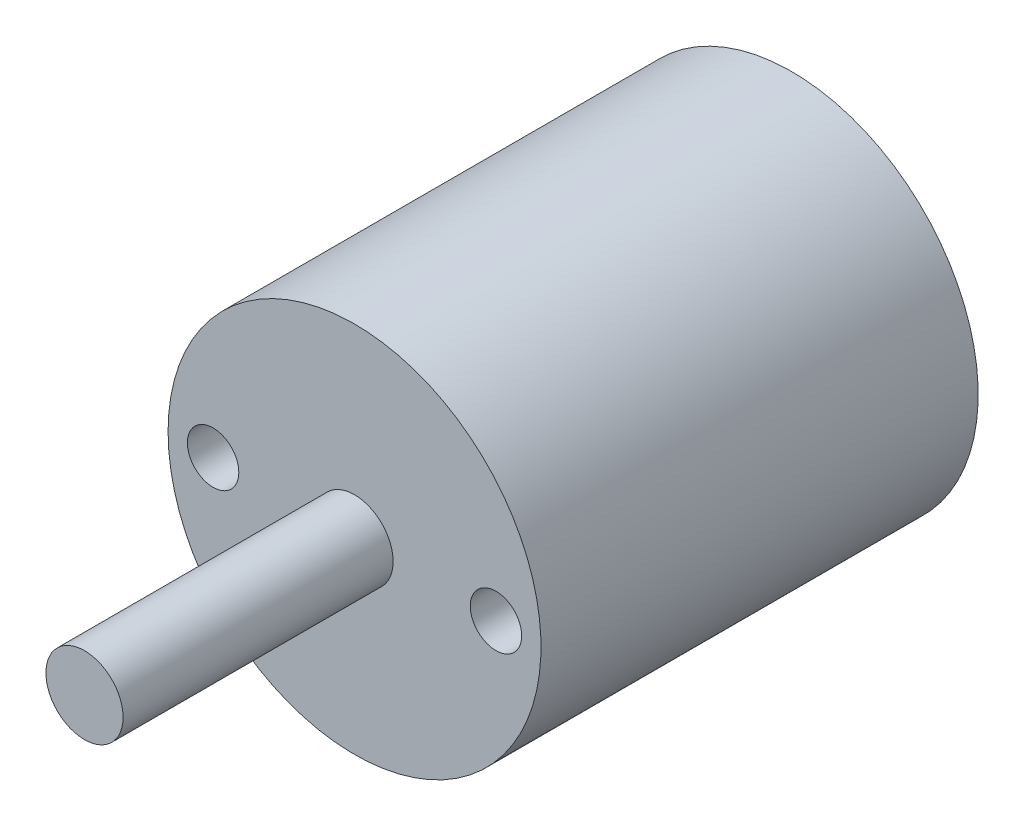
ISO-10303-21;
HEADER;
FILE_DESCRIPTION(('STEP AP214'),'2;1');
FILE_NAME('part.step','',(''),(''),'','','');
FILE_SCHEMA(('AUTOMOTIVE_DESIGN { 1 0 10303 214 1 1 1 1 }'));
ENDSEC;
DATA;
#1=APPLICATION_CONTEXT('core data for automotive mechanical design processes');
#2=APPLICATION_PROTOCOL_DEFINITION('international standard','automotive_design',2000,#1);
#3=PRODUCT_CONTEXT('',#1,'mechanical');
#4=PRODUCT('Part','Part','',(#3));
#5=PRODUCT_RELATED_PRODUCT_CATEGORY('part','',(#4));
#6=PRODUCT_DEFINITION_FORMATION('','',#4);
#7=PRODUCT_DEFINITION_CONTEXT('part definition',#1,'design');
#8=PRODUCT_DEFINITION('design','',#6,#7);
#9=PRODUCT_DEFINITION_SHAPE('','',#8);
#10=(LENGTH_UNIT() NAMED_UNIT(*) SI_UNIT(.MILLI.,.METRE.));
#11=(NAMED_UNIT(*) PLANE_ANGLE_UNIT() SI_UNIT($,.RADIAN.));
#12=(NAMED_UNIT(*) SI_UNIT($,.STERADIAN.) SOLID_ANGLE_UNIT());
#13=UNCERTAINTY_MEASURE_WITH_UNIT(LENGTH_MEASURE(1.E-05),#10,'distance_accuracy_value','');
#14=(GEOMETRIC_REPRESENTATION_CONTEXT(3) GLOBAL_UNCERTAINTY_ASSIGNED_CONTEXT((#13)) GLOBAL_UNIT_ASSIGNED_CONTEXT((#10,
#11,#12)) REPRESENTATION_CONTEXT('',''));
#15=CARTESIAN_POINT('',(0.,0.,0.));
#16=DIRECTION('',(0.,0.,1.));
#17=DIRECTION('',(1.,0.,0.));
#18=AXIS2_PLACEMENT_3D('',#15,#16,#17);
#19=CARTESIAN_POINT('',(0.,0.,0.));
#20=DIRECTION('',(0.,0.,1.));
#21=DIRECTION('',(1.,0.,0.));
#22=AXIS2_PLACEMENT_3D('',#19,#20,#21);
#23=PLANE('',#22);
#24=CARTESIAN_POINT('',(0.,0.,0.));
#25=DIRECTION('',(0.,0.,1.));
#26=DIRECTION('',(1.,0.,0.));
#27=AXIS2_PLACEMENT_3D('',#24,#25,#26);
#28=CIRCLE('',#27,7.25);
#29=CARTESIAN_POINT('',(-7.25,0.,0.));
#30=VERTEX_POINT('',#29);
#31=EDGE_CURVE('P0_E11',#30,#30,#28,.T.);
#32=ORIENTED_EDGE('',*,*,#31,.F.);
#33=EDGE_LOOP('',(#32));
#34=FACE_BOUND('',#33,.T.);
#35=ADVANCED_FACE('P0_F16',(#34),#23,.F.);
#36=CARTESIAN_POINT('',(0.,0.,17.));
#37=DIRECTION('',(0.,0.,1.));
#38=DIRECTION('',(1.,0.,0.));
#39=AXIS2_PLACEMENT_3D('',#36,#37,#38);
#40=PLANE('',#39);
#41=CARTESIAN_POINT('',(5.5,0.,17.));
#42=DIRECTION('',(0.,0.,-1.));
#43=DIRECTION('',(-1.,0.,0.));
#44=AXIS2_PLACEMENT_3D('',#41,#42,#43);
#45=CIRCLE('',#44,1.);
#46=CARTESIAN_POINT('',(6.5,0.,17.));
#47=VERTEX_POINT('',#46);
#48=EDGE_CURVE('P0_E72',#47,#47,#45,.T.);
#49=ORIENTED_EDGE('',*,*,#48,.T.);
#50=EDGE_LOOP('',(#49));
#51=FACE_BOUND('',#50,.T.);
#52=CARTESIAN_POINT('',(-5.5,0.,17.));
#53=DIRECTION('',(0.,0.,-1.));
#54=DIRECTION('',(-1.,0.,0.));
#55=AXIS2_PLACEMENT_3D('',#52,#53,#54);
#56=CIRCLE('',#55,1.);
#57=CARTESIAN_POINT('',(-4.5,0.,17.));
#58=VERTEX_POINT('',#57);
#59=EDGE_CURVE('P0_E56',#58,#58,#56,.T.);
#60=ORIENTED_EDGE('',*,*,#59,.T.);
#61=EDGE_LOOP('',(#60));
#62=FACE_BOUND('',#61,.T.);
#63=CARTESIAN_POINT('',(0.,0.,17.));
#64=DIRECTION('',(0.,0.,1.));
#65=DIRECTION('',(1.,0.,0.));
#66=AXIS2_PLACEMENT_3D('',#63,#64,#65);
#67=CIRCLE('',#66,7.25);
#68=CARTESIAN_POINT('',(-7.25,0.,17.));
#69=VERTEX_POINT('',#68);
#70=EDGE_CURVE('P0_E78',#69,#69,#67,.T.);
#71=ORIENTED_EDGE('',*,*,#70,.T.);
#72=EDGE_LOOP('',(#71));
#73=FACE_BOUND('',#72,.T.);
#74=ADVANCED_FACE('P0_F62',(#51,#62,#73),#40,.T.);
#75=CARTESIAN_POINT('',(0.,0.,0.));
#76=DIRECTION('',(0.,0.,1.));
#77=DIRECTION('',(1.,0.,0.));
#78=AXIS2_PLACEMENT_3D('',#75,#76,#77);
#79=CYLINDRICAL_SURFACE('',#78,7.25);
#80=ORIENTED_EDGE('',*,*,#70,.F.);
#81=DIRECTION('',(0.,0.,-1.));
#82=VECTOR('',#81,1.);
#83=CARTESIAN_POINT('',(-7.25,0.,0.));
#84=LINE('',#83,#82);
#85=EDGE_CURVE('P0_E27',#69,#30,#84,.T.);
#86=ORIENTED_EDGE('',*,*,#85,.T.);
#87=ORIENTED_EDGE('',*,*,#31,.T.);
#88=ORIENTED_EDGE('',*,*,#85,.F.);
#89=EDGE_LOOP('',(#80,#86,#87,#88));
#90=FACE_BOUND('',#89,.T.);
#91=ADVANCED_FACE('P0_F121',(#90),#79,.T.);
#92=CARTESIAN_POINT('',(5.5,0.,12.));
#93=DIRECTION('',(0.,0.,1.));
#94=DIRECTION('',(1.,0.,0.));
#95=AXIS2_PLACEMENT_3D('',#92,#93,#94);
#96=PLANE('',#95);
#97=CARTESIAN_POINT('',(5.5,0.,12.));
#98=DIRECTION('',(0.,0.,-1.));
#99=DIRECTION('',(-1.,0.,0.));
#100=AXIS2_PLACEMENT_3D('',#97,#98,#99);
#101=CIRCLE('',#100,1.);
#102=CARTESIAN_POINT('',(6.5,0.,12.));
#103=VERTEX_POINT('',#102);
#104=EDGE_CURVE('P0_E70',#103,#103,#101,.T.);
#105=ORIENTED_EDGE('',*,*,#104,.F.);
#106=EDGE_LOOP('',(#105));
#107=FACE_BOUND('',#106,.T.);
#108=ADVANCED_FACE('P0_F18',(#107),#96,.T.);
#109=CARTESIAN_POINT('',(5.5,0.,17.));
#110=DIRECTION('',(0.,0.,-1.));
#111=DIRECTION('',(-1.,0.,0.));
#112=AXIS2_PLACEMENT_3D('',#109,#110,#111);
#113=CYLINDRICAL_SURFACE('',#112,1.);
#114=ORIENTED_EDGE('',*,*,#48,.F.);
#115=DIRECTION('',(0.,0.,-1.));
#116=VECTOR('',#115,1.);
#117=CARTESIAN_POINT('',(6.5,0.,17.));
#118=LINE('',#117,#116);
#119=EDGE_CURVE('P0_E20',#47,#103,#118,.T.);
#120=ORIENTED_EDGE('',*,*,#119,.T.);
#121=ORIENTED_EDGE('',*,*,#104,.T.);
#122=ORIENTED_EDGE('',*,*,#119,.F.);
#123=EDGE_LOOP('',(#114,#120,#121,#122));
#124=FACE_BOUND('',#123,.T.);
#125=ADVANCED_FACE('P0_F127',(#124),#113,.F.);
#126=CARTESIAN_POINT('',(-5.5,0.,12.));
#127=DIRECTION('',(0.,0.,1.));
#128=DIRECTION('',(1.,0.,0.));
#129=AXIS2_PLACEMENT_3D('',#126,#127,#128);
#130=PLANE('',#129);
#131=CARTESIAN_POINT('',(-5.5,0.,12.));
#132=DIRECTION('',(0.,0.,-1.));
#133=DIRECTION('',(-1.,0.,0.));
#134=AXIS2_PLACEMENT_3D('',#131,#132,#133);
#135=CIRCLE('',#134,1.);
#136=CARTESIAN_POINT('',(-4.5,0.,12.));
#137=VERTEX_POINT('',#136);
#138=EDGE_CURVE('P0_E58',#137,#137,#135,.T.);
#139=ORIENTED_EDGE('',*,*,#138,.F.);
#140=EDGE_LOOP('',(#139));
#141=FACE_BOUND('',#140,.T.);
#142=ADVANCED_FACE('P0_F132',(#141),#130,.T.);
#143=CARTESIAN_POINT('',(-5.5,0.,17.));
#144=DIRECTION('',(0.,0.,-1.));
#145=DIRECTION('',(-1.,0.,0.));
#146=AXIS2_PLACEMENT_3D('',#143,#144,#145);
#147=CYLINDRICAL_SURFACE('',#146,1.);
#148=ORIENTED_EDGE('',*,*,#59,.F.);
#149=DIRECTION('',(0.,0.,-1.));
#150=VECTOR('',#149,1.);
#151=CARTESIAN_POINT('',(-4.5,0.,17.));
#152=LINE('',#151,#150);
#153=EDGE_CURVE('P0_E53',#58,#137,#152,.T.);
#154=ORIENTED_EDGE('',*,*,#153,.T.);
#155=ORIENTED_EDGE('',*,*,#138,.T.);
#156=ORIENTED_EDGE('',*,*,#153,.F.);
#157=EDGE_LOOP('',(#148,#154,#155,#156));
#158=FACE_BOUND('',#157,.T.);
#159=ADVANCED_FACE('P0_F55',(#158),#147,.F.);
#160=CLOSED_SHELL('',(#35,#74,#91,#108,#125,#142,#159));
#161=MANIFOLD_SOLID_BREP('P0_B1',#160);
#162=CARTESIAN_POINT('',(0.,0.,17.));
#163=DIRECTION('',(0.,0.,1.));
#164=DIRECTION('',(1.,0.,0.));
#165=AXIS2_PLACEMENT_3D('',#162,#163,#164);
#166=PLANE('',#165);
#167=CARTESIAN_POINT('',(0.,0.,17.));
#168=DIRECTION('',(0.,0.,1.));
#169=DIRECTION('',(-1.,0.,0.));
#170=AXIS2_PLACEMENT_3D('',#167,#168,#169);
#171=CIRCLE('',#170,1.5);
#172=CARTESIAN_POINT('',(1.5,0.,17.));
#173=VERTEX_POINT('',#172);
#174=EDGE_CURVE('P1_E11',#173,#173,#171,.T.);
#175=ORIENTED_EDGE('',*,*,#174,.F.);
#176=EDGE_LOOP('',(#175));
#177=FACE_BOUND('',#176,.T.);
#178=ADVANCED_FACE('P1_F16',(#177),#166,.F.);
#179=CARTESIAN_POINT('',(0.,0.,27.5));
#180=DIRECTION('',(0.,0.,1.));
#181=DIRECTION('',(1.,0.,0.));
#182=AXIS2_PLACEMENT_3D('',#179,#180,#181);
#183=PLANE('',#182);
#184=CARTESIAN_POINT('',(0.,0.,27.5));
#185=DIRECTION('',(0.,0.,1.));
#186=DIRECTION('',(-1.,0.,0.));
#187=AXIS2_PLACEMENT_3D('',#184,#185,#186);
#188=CIRCLE('',#187,1.5);
#189=CARTESIAN_POINT('',(1.5,0.,27.5));
#190=VERTEX_POINT('',#189);
#191=EDGE_CURVE('P1_E41',#190,#190,#188,.T.);
#192=ORIENTED_EDGE('',*,*,#191,.T.);
#193=EDGE_LOOP('',(#192));
#194=FACE_BOUND('',#193,.T.);
#195=ADVANCED_FACE('P1_F18',(#194),#183,.T.);
#196=CARTESIAN_POINT('',(0.,0.,17.));
#197=DIRECTION('',(0.,0.,1.));
#198=DIRECTION('',(-1.,0.,0.));
#199=AXIS2_PLACEMENT_3D('',#196,#197,#198);
#200=CYLINDRICAL_SURFACE('',#199,1.5);
#201=ORIENTED_EDGE('',*,*,#191,.F.);
#202=DIRECTION('',(0.,0.,-1.));
#203=VECTOR('',#202,1.);
#204=CARTESIAN_POINT('',(1.5,0.,17.));
#205=LINE('',#204,#203);
#206=EDGE_CURVE('P1_E25',#190,#173,#205,.T.);
#207=ORIENTED_EDGE('',*,*,#206,.T.);
#208=ORIENTED_EDGE('',*,*,#174,.T.);
#209=ORIENTED_EDGE('',*,*,#206,.F.);
#210=EDGE_LOOP('',(#201,#207,#208,#209));
#211=FACE_BOUND('',#210,.T.);
#212=ADVANCED_FACE('P1_F40',(#211),#200,.T.);
#213=CLOSED_SHELL('',(#178,#195,#212));
#214=MANIFOLD_SOLID_BREP('P1_B1',#213);
#215=ADVANCED_BREP_SHAPE_REPRESENTATION('',(#18,#161,#214),#14);
#216=SHAPE_DEFINITION_REPRESENTATION(#9,#215);
ENDSEC;
END-ISO-10303-21;
